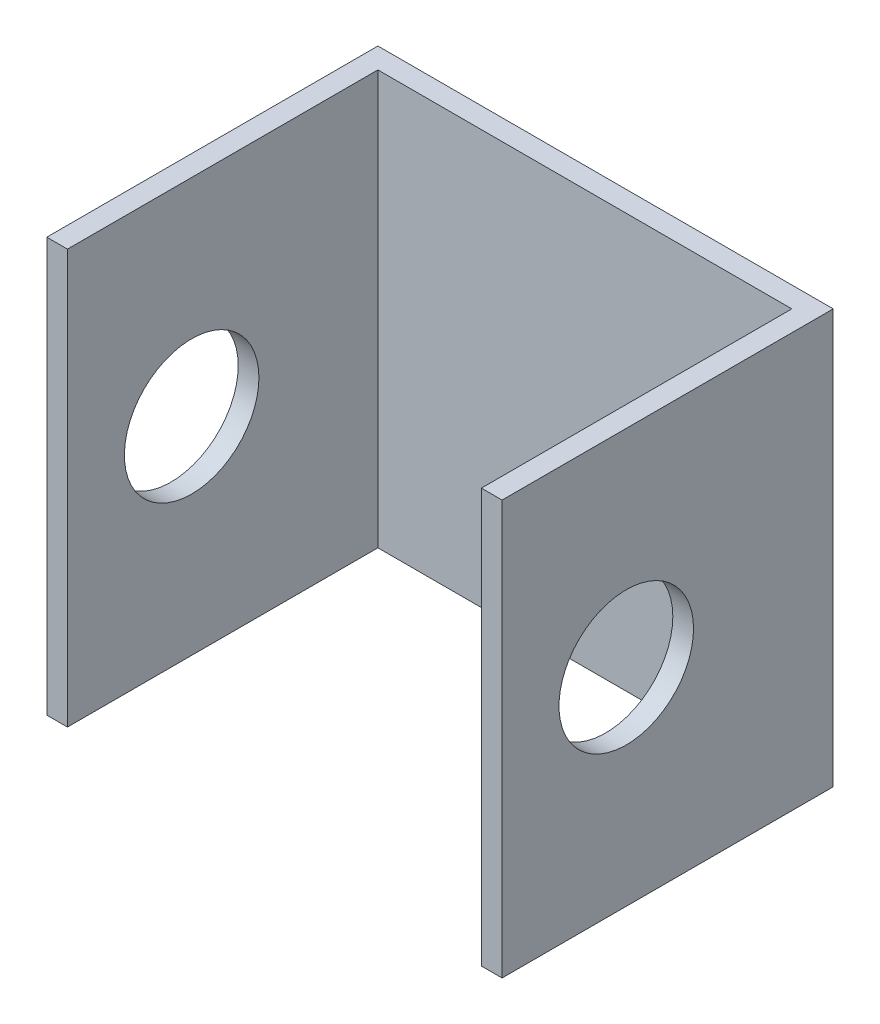
ISO-10303-21;
HEADER;
FILE_DESCRIPTION(('STEP AP214'),'2;1');
FILE_NAME('part.step','',(''),(''),'','','');
FILE_SCHEMA(('AUTOMOTIVE_DESIGN { 1 0 10303 214 1 1 1 1 }'));
ENDSEC;
DATA;
#1=APPLICATION_CONTEXT('core data for automotive mechanical design processes');
#2=APPLICATION_PROTOCOL_DEFINITION('international standard','automotive_design',2000,#1);
#3=PRODUCT_CONTEXT('',#1,'mechanical');
#4=PRODUCT('Part','Part','',(#3));
#5=PRODUCT_RELATED_PRODUCT_CATEGORY('part','',(#4));
#6=PRODUCT_DEFINITION_FORMATION('','',#4);
#7=PRODUCT_DEFINITION_CONTEXT('part definition',#1,'design');
#8=PRODUCT_DEFINITION('design','',#6,#7);
#9=PRODUCT_DEFINITION_SHAPE('','',#8);
#10=(LENGTH_UNIT() NAMED_UNIT(*) SI_UNIT(.MILLI.,.METRE.));
#11=(NAMED_UNIT(*) PLANE_ANGLE_UNIT() SI_UNIT($,.RADIAN.));
#12=(NAMED_UNIT(*) SI_UNIT($,.STERADIAN.) SOLID_ANGLE_UNIT());
#13=UNCERTAINTY_MEASURE_WITH_UNIT(LENGTH_MEASURE(1.E-05),#10,'distance_accuracy_value','');
#14=(GEOMETRIC_REPRESENTATION_CONTEXT(3) GLOBAL_UNCERTAINTY_ASSIGNED_CONTEXT((#13)) GLOBAL_UNIT_ASSIGNED_CONTEXT((#10,
#11,#12)) REPRESENTATION_CONTEXT('',''));
#15=CARTESIAN_POINT('',(0.,0.,0.));
#16=DIRECTION('',(0.,0.,1.));
#17=DIRECTION('',(1.,0.,0.));
#18=AXIS2_PLACEMENT_3D('',#15,#16,#17);
#19=CARTESIAN_POINT('',(0.,0.,1.));
#20=DIRECTION('',(0.,0.,-1.));
#21=DIRECTION('',(-1.,0.,0.));
#22=AXIS2_PLACEMENT_3D('',#19,#20,#21);
#23=PLANE('',#22);
#24=DIRECTION('',(0.,-1.,0.));
#25=VECTOR('',#24,1.);
#26=CARTESIAN_POINT('',(10.,10.,1.));
#27=LINE('',#26,#25);
#28=CARTESIAN_POINT('',(10.,10.,1.));
#29=VERTEX_POINT('',#28);
#30=CARTESIAN_POINT('',(10.,-10.,1.));
#31=VERTEX_POINT('',#30);
#32=EDGE_CURVE('E49',#29,#31,#27,.T.);
#33=ORIENTED_EDGE('',*,*,#32,.F.);
#34=DIRECTION('',(-1.,0.,0.));
#35=VECTOR('',#34,1.);
#36=CARTESIAN_POINT('',(-11.,10.,1.));
#37=LINE('',#36,#35);
#38=CARTESIAN_POINT('',(-10.,10.,1.));
#39=VERTEX_POINT('',#38);
#40=EDGE_CURVE('E119',#29,#39,#37,.T.);
#41=ORIENTED_EDGE('',*,*,#40,.T.);
#42=DIRECTION('',(0.,1.,0.));
#43=VECTOR('',#42,1.);
#44=CARTESIAN_POINT('',(-10.,10.,1.));
#45=LINE('',#44,#43);
#46=CARTESIAN_POINT('',(-10.,-10.,1.));
#47=VERTEX_POINT('',#46);
#48=EDGE_CURVE('E120',#47,#39,#45,.T.);
#49=ORIENTED_EDGE('',*,*,#48,.F.);
#50=DIRECTION('',(1.,0.,0.));
#51=VECTOR('',#50,1.);
#52=CARTESIAN_POINT('',(-11.,-10.,1.));
#53=LINE('',#52,#51);
#54=EDGE_CURVE('E54',#47,#31,#53,.T.);
#55=ORIENTED_EDGE('',*,*,#54,.T.);
#56=EDGE_LOOP('',(#33,#41,#49,#55));
#57=FACE_BOUND('',#56,.T.);
#58=ADVANCED_FACE('F33',(#57),#23,.F.);
#59=CARTESIAN_POINT('',(11.,-10.,1.));
#60=DIRECTION('',(-1.,0.,0.));
#61=DIRECTION('',(0.,0.,1.));
#62=AXIS2_PLACEMENT_3D('',#59,#60,#61);
#63=PLANE('',#62);
#64=CARTESIAN_POINT('',(11.,0.,10.));
#65=DIRECTION('',(1.,0.,0.));
#66=DIRECTION('',(0.,0.,-1.));
#67=AXIS2_PLACEMENT_3D('',#64,#65,#66);
#68=CIRCLE('',#67,3.25);
#69=CARTESIAN_POINT('',(11.,0.,6.75));
#70=VERTEX_POINT('',#69);
#71=EDGE_CURVE('E183',#70,#70,#68,.T.);
#72=ORIENTED_EDGE('',*,*,#71,.F.);
#73=EDGE_LOOP('',(#72));
#74=FACE_BOUND('',#73,.T.);
#75=DIRECTION('',(0.,1.,0.));
#76=VECTOR('',#75,1.);
#77=CARTESIAN_POINT('',(11.,-10.,0.));
#78=LINE('',#77,#76);
#79=CARTESIAN_POINT('',(11.,-10.,0.));
#80=VERTEX_POINT('',#79);
#81=CARTESIAN_POINT('',(11.,10.,0.));
#82=VERTEX_POINT('',#81);
#83=EDGE_CURVE('E142',#80,#82,#78,.T.);
#84=ORIENTED_EDGE('',*,*,#83,.T.);
#85=DIRECTION('',(0.,0.,-1.));
#86=VECTOR('',#85,1.);
#87=CARTESIAN_POINT('',(11.,10.,1.));
#88=LINE('',#87,#86);
#89=CARTESIAN_POINT('',(11.,10.,16.));
#90=VERTEX_POINT('',#89);
#91=EDGE_CURVE('E11',#90,#82,#88,.T.);
#92=ORIENTED_EDGE('',*,*,#91,.F.);
#93=DIRECTION('',(0.,1.,0.));
#94=VECTOR('',#93,1.);
#95=CARTESIAN_POINT('',(11.,10.,16.));
#96=LINE('',#95,#94);
#97=CARTESIAN_POINT('',(11.,-10.,16.));
#98=VERTEX_POINT('',#97);
#99=EDGE_CURVE('E114',#98,#90,#96,.T.);
#100=ORIENTED_EDGE('',*,*,#99,.F.);
#101=DIRECTION('',(0.,0.,-1.));
#102=VECTOR('',#101,1.);
#103=CARTESIAN_POINT('',(11.,-10.,1.));
#104=LINE('',#103,#102);
#105=EDGE_CURVE('E146',#98,#80,#104,.T.);
#106=ORIENTED_EDGE('',*,*,#105,.T.);
#107=EDGE_LOOP('',(#84,#92,#100,#106));
#108=FACE_BOUND('',#107,.T.);
#109=ADVANCED_FACE('F35',(#74,#108),#63,.F.);
#110=CARTESIAN_POINT('',(-11.,10.,1.));
#111=DIRECTION('',(0.,-1.,0.));
#112=DIRECTION('',(0.,0.,-1.));
#113=AXIS2_PLACEMENT_3D('',#110,#111,#112);
#114=PLANE('',#113);
#115=DIRECTION('',(-1.,0.,0.));
#116=VECTOR('',#115,1.);
#117=CARTESIAN_POINT('',(-11.,10.,0.));
#118=LINE('',#117,#116);
#119=CARTESIAN_POINT('',(-11.,10.,0.));
#120=VERTEX_POINT('',#119);
#121=EDGE_CURVE('E149',#82,#120,#118,.T.);
#122=ORIENTED_EDGE('',*,*,#121,.T.);
#123=DIRECTION('',(0.,0.,-1.));
#124=VECTOR('',#123,1.);
#125=CARTESIAN_POINT('',(-11.,10.,1.));
#126=LINE('',#125,#124);
#127=CARTESIAN_POINT('',(-11.,10.,16.));
#128=VERTEX_POINT('',#127);
#129=EDGE_CURVE('E42',#128,#120,#126,.T.);
#130=ORIENTED_EDGE('',*,*,#129,.F.);
#131=DIRECTION('',(-1.,0.,0.));
#132=VECTOR('',#131,1.);
#133=CARTESIAN_POINT('',(-11.,10.,16.));
#134=LINE('',#133,#132);
#135=CARTESIAN_POINT('',(-10.,10.,16.));
#136=VERTEX_POINT('',#135);
#137=EDGE_CURVE('E123',#136,#128,#134,.T.);
#138=ORIENTED_EDGE('',*,*,#137,.F.);
#139=DIRECTION('',(0.,0.,-1.));
#140=VECTOR('',#139,1.);
#141=CARTESIAN_POINT('',(-10.,10.,16.));
#142=LINE('',#141,#140);
#143=EDGE_CURVE('E136',#136,#39,#142,.T.);
#144=ORIENTED_EDGE('',*,*,#143,.T.);
#145=ORIENTED_EDGE('',*,*,#40,.F.);
#146=DIRECTION('',(0.,0.,-1.));
#147=VECTOR('',#146,1.);
#148=CARTESIAN_POINT('',(10.,10.,16.));
#149=LINE('',#148,#147);
#150=CARTESIAN_POINT('',(10.,10.,16.));
#151=VERTEX_POINT('',#150);
#152=EDGE_CURVE('E101',#151,#29,#149,.T.);
#153=ORIENTED_EDGE('',*,*,#152,.F.);
#154=DIRECTION('',(-1.,0.,0.));
#155=VECTOR('',#154,1.);
#156=CARTESIAN_POINT('',(11.,10.,16.));
#157=LINE('',#156,#155);
#158=EDGE_CURVE('E108',#90,#151,#157,.T.);
#159=ORIENTED_EDGE('',*,*,#158,.F.);
#160=ORIENTED_EDGE('',*,*,#91,.T.);
#161=EDGE_LOOP('',(#122,#130,#138,#144,#145,#153,#159,#160));
#162=FACE_BOUND('',#161,.T.);
#163=ADVANCED_FACE('F117',(#162),#114,.F.);
#164=CARTESIAN_POINT('',(-11.,-10.,1.));
#165=DIRECTION('',(1.,0.,0.));
#166=DIRECTION('',(0.,0.,-1.));
#167=AXIS2_PLACEMENT_3D('',#164,#165,#166);
#168=PLANE('',#167);
#169=CARTESIAN_POINT('',(-11.,0.,10.));
#170=DIRECTION('',(1.,0.,0.));
#171=DIRECTION('',(0.,0.,-1.));
#172=AXIS2_PLACEMENT_3D('',#169,#170,#171);
#173=CIRCLE('',#172,3.25);
#174=CARTESIAN_POINT('',(-11.,0.,6.75));
#175=VERTEX_POINT('',#174);
#176=EDGE_CURVE('E181',#175,#175,#173,.T.);
#177=ORIENTED_EDGE('',*,*,#176,.T.);
#178=EDGE_LOOP('',(#177));
#179=FACE_BOUND('',#178,.T.);
#180=DIRECTION('',(0.,-1.,0.));
#181=VECTOR('',#180,1.);
#182=CARTESIAN_POINT('',(-11.,-10.,0.));
#183=LINE('',#182,#181);
#184=CARTESIAN_POINT('',(-11.,-10.,0.));
#185=VERTEX_POINT('',#184);
#186=EDGE_CURVE('E151',#120,#185,#183,.T.);
#187=ORIENTED_EDGE('',*,*,#186,.T.);
#188=DIRECTION('',(0.,0.,-1.));
#189=VECTOR('',#188,1.);
#190=CARTESIAN_POINT('',(-11.,-10.,1.));
#191=LINE('',#190,#189);
#192=CARTESIAN_POINT('',(-11.,-10.,16.));
#193=VERTEX_POINT('',#192);
#194=EDGE_CURVE('E156',#193,#185,#191,.T.);
#195=ORIENTED_EDGE('',*,*,#194,.F.);
#196=DIRECTION('',(0.,-1.,0.));
#197=VECTOR('',#196,1.);
#198=CARTESIAN_POINT('',(-11.,10.,16.));
#199=LINE('',#198,#197);
#200=EDGE_CURVE('E130',#128,#193,#199,.T.);
#201=ORIENTED_EDGE('',*,*,#200,.F.);
#202=ORIENTED_EDGE('',*,*,#129,.T.);
#203=EDGE_LOOP('',(#187,#195,#201,#202));
#204=FACE_BOUND('',#203,.T.);
#205=ADVANCED_FACE('F163',(#179,#204),#168,.F.);
#206=CARTESIAN_POINT('',(-11.,-10.,1.));
#207=DIRECTION('',(0.,1.,0.));
#208=DIRECTION('',(0.,0.,1.));
#209=AXIS2_PLACEMENT_3D('',#206,#207,#208);
#210=PLANE('',#209);
#211=DIRECTION('',(1.,0.,0.));
#212=VECTOR('',#211,1.);
#213=CARTESIAN_POINT('',(-11.,-10.,0.));
#214=LINE('',#213,#212);
#215=EDGE_CURVE('E144',#185,#80,#214,.T.);
#216=ORIENTED_EDGE('',*,*,#215,.T.);
#217=ORIENTED_EDGE('',*,*,#105,.F.);
#218=DIRECTION('',(1.,0.,0.));
#219=VECTOR('',#218,1.);
#220=CARTESIAN_POINT('',(11.,-10.,16.));
#221=LINE('',#220,#219);
#222=CARTESIAN_POINT('',(10.,-10.,16.));
#223=VERTEX_POINT('',#222);
#224=EDGE_CURVE('E107',#223,#98,#221,.T.);
#225=ORIENTED_EDGE('',*,*,#224,.F.);
#226=DIRECTION('',(0.,0.,-1.));
#227=VECTOR('',#226,1.);
#228=CARTESIAN_POINT('',(10.,-10.,16.));
#229=LINE('',#228,#227);
#230=EDGE_CURVE('E103',#223,#31,#229,.T.);
#231=ORIENTED_EDGE('',*,*,#230,.T.);
#232=ORIENTED_EDGE('',*,*,#54,.F.);
#233=DIRECTION('',(0.,0.,-1.));
#234=VECTOR('',#233,1.);
#235=CARTESIAN_POINT('',(-10.,-10.,16.));
#236=LINE('',#235,#234);
#237=CARTESIAN_POINT('',(-10.,-10.,16.));
#238=VERTEX_POINT('',#237);
#239=EDGE_CURVE('E139',#238,#47,#236,.T.);
#240=ORIENTED_EDGE('',*,*,#239,.F.);
#241=DIRECTION('',(1.,0.,0.));
#242=VECTOR('',#241,1.);
#243=CARTESIAN_POINT('',(-11.,-10.,16.));
#244=LINE('',#243,#242);
#245=EDGE_CURVE('E133',#193,#238,#244,.T.);
#246=ORIENTED_EDGE('',*,*,#245,.F.);
#247=ORIENTED_EDGE('',*,*,#194,.T.);
#248=EDGE_LOOP('',(#216,#217,#225,#231,#232,#240,#246,#247));
#249=FACE_BOUND('',#248,.T.);
#250=ADVANCED_FACE('F170',(#249),#210,.F.);
#251=CARTESIAN_POINT('',(0.,0.,0.));
#252=DIRECTION('',(0.,0.,-1.));
#253=DIRECTION('',(-1.,0.,0.));
#254=AXIS2_PLACEMENT_3D('',#251,#252,#253);
#255=PLANE('',#254);
#256=ORIENTED_EDGE('',*,*,#83,.F.);
#257=ORIENTED_EDGE('',*,*,#215,.F.);
#258=ORIENTED_EDGE('',*,*,#186,.F.);
#259=ORIENTED_EDGE('',*,*,#121,.F.);
#260=EDGE_LOOP('',(#256,#257,#258,#259));
#261=FACE_BOUND('',#260,.T.);
#262=ADVANCED_FACE('F168',(#261),#255,.T.);
#263=CARTESIAN_POINT('',(-10.,10.,16.));
#264=DIRECTION('',(-1.,0.,0.));
#265=DIRECTION('',(0.,-1.,0.));
#266=AXIS2_PLACEMENT_3D('',#263,#264,#265);
#267=PLANE('',#266);
#268=CARTESIAN_POINT('',(-10.,0.,10.));
#269=DIRECTION('',(-1.,0.,0.));
#270=DIRECTION('',(0.,-1.,0.));
#271=AXIS2_PLACEMENT_3D('',#268,#269,#270);
#272=CIRCLE('',#271,3.25);
#273=CARTESIAN_POINT('',(-10.,-3.25,10.));
#274=VERTEX_POINT('',#273);
#275=EDGE_CURVE('E175',#274,#274,#272,.T.);
#276=ORIENTED_EDGE('',*,*,#275,.T.);
#277=EDGE_LOOP('',(#276));
#278=FACE_BOUND('',#277,.T.);
#279=ORIENTED_EDGE('',*,*,#48,.T.);
#280=ORIENTED_EDGE('',*,*,#143,.F.);
#281=DIRECTION('',(0.,1.,0.));
#282=VECTOR('',#281,1.);
#283=CARTESIAN_POINT('',(-10.,10.,16.));
#284=LINE('',#283,#282);
#285=EDGE_CURVE('E135',#238,#136,#284,.T.);
#286=ORIENTED_EDGE('',*,*,#285,.F.);
#287=ORIENTED_EDGE('',*,*,#239,.T.);
#288=EDGE_LOOP('',(#279,#280,#286,#287));
#289=FACE_BOUND('',#288,.T.);
#290=ADVANCED_FACE('F208',(#278,#289),#267,.F.);
#291=CARTESIAN_POINT('',(0.,0.,16.));
#292=DIRECTION('',(0.,0.,-1.));
#293=DIRECTION('',(-1.,0.,0.));
#294=AXIS2_PLACEMENT_3D('',#291,#292,#293);
#295=PLANE('',#294);
#296=ORIENTED_EDGE('',*,*,#137,.T.);
#297=ORIENTED_EDGE('',*,*,#200,.T.);
#298=ORIENTED_EDGE('',*,*,#245,.T.);
#299=ORIENTED_EDGE('',*,*,#285,.T.);
#300=EDGE_LOOP('',(#296,#297,#298,#299));
#301=FACE_BOUND('',#300,.T.);
#302=ADVANCED_FACE('F239',(#301),#295,.F.);
#303=CARTESIAN_POINT('',(10.,10.,16.));
#304=DIRECTION('',(1.,0.,0.));
#305=DIRECTION('',(0.,1.,0.));
#306=AXIS2_PLACEMENT_3D('',#303,#304,#305);
#307=PLANE('',#306);
#308=CARTESIAN_POINT('',(10.,0.,10.));
#309=DIRECTION('',(1.,0.,0.));
#310=DIRECTION('',(0.,1.,0.));
#311=AXIS2_PLACEMENT_3D('',#308,#309,#310);
#312=CIRCLE('',#311,3.25);
#313=CARTESIAN_POINT('',(10.,3.25,10.));
#314=VERTEX_POINT('',#313);
#315=EDGE_CURVE('E37',#314,#314,#312,.T.);
#316=ORIENTED_EDGE('',*,*,#315,.T.);
#317=EDGE_LOOP('',(#316));
#318=FACE_BOUND('',#317,.T.);
#319=ORIENTED_EDGE('',*,*,#32,.T.);
#320=ORIENTED_EDGE('',*,*,#230,.F.);
#321=DIRECTION('',(0.,-1.,0.));
#322=VECTOR('',#321,1.);
#323=CARTESIAN_POINT('',(10.,10.,16.));
#324=LINE('',#323,#322);
#325=EDGE_CURVE('E97',#151,#223,#324,.T.);
#326=ORIENTED_EDGE('',*,*,#325,.F.);
#327=ORIENTED_EDGE('',*,*,#152,.T.);
#328=EDGE_LOOP('',(#319,#320,#326,#327));
#329=FACE_BOUND('',#328,.T.);
#330=ADVANCED_FACE('F99',(#318,#329),#307,.F.);
#331=CARTESIAN_POINT('',(0.,0.,16.));
#332=DIRECTION('',(0.,0.,1.));
#333=DIRECTION('',(1.,0.,0.));
#334=AXIS2_PLACEMENT_3D('',#331,#332,#333);
#335=PLANE('',#334);
#336=ORIENTED_EDGE('',*,*,#158,.T.);
#337=ORIENTED_EDGE('',*,*,#325,.T.);
#338=ORIENTED_EDGE('',*,*,#224,.T.);
#339=ORIENTED_EDGE('',*,*,#99,.T.);
#340=EDGE_LOOP('',(#336,#337,#338,#339));
#341=FACE_BOUND('',#340,.T.);
#342=ADVANCED_FACE('F112',(#341),#335,.T.);
#343=CARTESIAN_POINT('',(-11.,0.,10.));
#344=DIRECTION('',(1.,0.,0.));
#345=DIRECTION('',(0.,0.,-1.));
#346=AXIS2_PLACEMENT_3D('',#343,#344,#345);
#347=CYLINDRICAL_SURFACE('',#346,3.25);
#348=ORIENTED_EDGE('',*,*,#71,.T.);
#349=EDGE_LOOP('',(#348));
#350=FACE_BOUND('',#349,.T.);
#351=ORIENTED_EDGE('',*,*,#315,.F.);
#352=EDGE_LOOP('',(#351));
#353=FACE_BOUND('',#352,.T.);
#354=ADVANCED_FACE('F193',(#350,#353),#347,.F.);
#355=ORIENTED_EDGE('',*,*,#176,.F.);
#356=EDGE_LOOP('',(#355));
#357=FACE_BOUND('',#356,.T.);
#358=ORIENTED_EDGE('',*,*,#275,.F.);
#359=EDGE_LOOP('',(#358));
#360=FACE_BOUND('',#359,.T.);
#361=ADVANCED_FACE('F190',(#357,#360),#347,.F.);
#362=CLOSED_SHELL('',(#58,#109,#163,#205,#250,#262,#290,#302,#330,#342,#354,#361));
#363=MANIFOLD_SOLID_BREP('B2',#362);
#364=ADVANCED_BREP_SHAPE_REPRESENTATION('',(#18,#363),#14);
#365=SHAPE_DEFINITION_REPRESENTATION(#9,#364);
ENDSEC;
END-ISO-10303-21;
